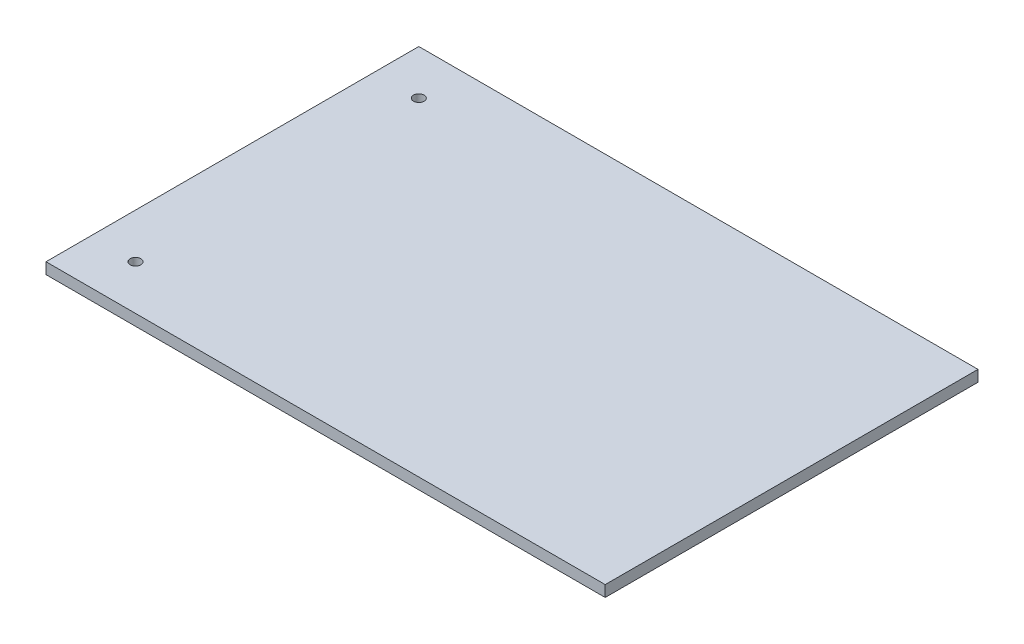
ISO-10303-21;
HEADER;
FILE_DESCRIPTION(('STEP AP214'),'2;1');
FILE_NAME('part.step','',(''),(''),'','','');
FILE_SCHEMA(('AUTOMOTIVE_DESIGN { 1 0 10303 214 1 1 1 1 }'));
ENDSEC;
DATA;
#1=APPLICATION_CONTEXT('core data for automotive mechanical design processes');
#2=APPLICATION_PROTOCOL_DEFINITION('international standard','automotive_design',2000,#1);
#3=PRODUCT_CONTEXT('',#1,'mechanical');
#4=PRODUCT('Part','Part','',(#3));
#5=PRODUCT_RELATED_PRODUCT_CATEGORY('part','',(#4));
#6=PRODUCT_DEFINITION_FORMATION('','',#4);
#7=PRODUCT_DEFINITION_CONTEXT('part definition',#1,'design');
#8=PRODUCT_DEFINITION('design','',#6,#7);
#9=PRODUCT_DEFINITION_SHAPE('','',#8);
#10=(LENGTH_UNIT() NAMED_UNIT(*) SI_UNIT(.MILLI.,.METRE.));
#11=(NAMED_UNIT(*) PLANE_ANGLE_UNIT() SI_UNIT($,.RADIAN.));
#12=(NAMED_UNIT(*) SI_UNIT($,.STERADIAN.) SOLID_ANGLE_UNIT());
#13=UNCERTAINTY_MEASURE_WITH_UNIT(LENGTH_MEASURE(1.E-05),#10,'distance_accuracy_value','');
#14=(GEOMETRIC_REPRESENTATION_CONTEXT(3) GLOBAL_UNCERTAINTY_ASSIGNED_CONTEXT((#13)) GLOBAL_UNIT_ASSIGNED_CONTEXT((#10,
#11,#12)) REPRESENTATION_CONTEXT('',''));
#15=CARTESIAN_POINT('',(0.,0.,0.));
#16=DIRECTION('',(0.,0.,1.));
#17=DIRECTION('',(1.,0.,0.));
#18=AXIS2_PLACEMENT_3D('',#15,#16,#17);
#19=CARTESIAN_POINT('',(-75.,3.,50.));
#20=DIRECTION('',(1.,0.,0.));
#21=DIRECTION('',(0.,0.,-1.));
#22=AXIS2_PLACEMENT_3D('',#19,#20,#21);
#23=PLANE('',#22);
#24=DIRECTION('',(0.,0.,1.));
#25=VECTOR('',#24,1.);
#26=CARTESIAN_POINT('',(-75.,0.,50.));
#27=LINE('',#26,#25);
#28=CARTESIAN_POINT('',(-75.,0.,-50.));
#29=VERTEX_POINT('',#28);
#30=CARTESIAN_POINT('',(-75.,0.,50.));
#31=VERTEX_POINT('',#30);
#32=EDGE_CURVE('E99',#29,#31,#27,.T.);
#33=ORIENTED_EDGE('',*,*,#32,.T.);
#34=DIRECTION('',(0.,-1.,0.));
#35=VECTOR('',#34,1.);
#36=CARTESIAN_POINT('',(-75.,3.,50.));
#37=LINE('',#36,#35);
#38=CARTESIAN_POINT('',(-75.,3.,50.));
#39=VERTEX_POINT('',#38);
#40=EDGE_CURVE('E11',#39,#31,#37,.T.);
#41=ORIENTED_EDGE('',*,*,#40,.F.);
#42=DIRECTION('',(0.,0.,1.));
#43=VECTOR('',#42,1.);
#44=CARTESIAN_POINT('',(-75.,3.,50.));
#45=LINE('',#44,#43);
#46=CARTESIAN_POINT('',(-75.,3.,-50.));
#47=VERTEX_POINT('',#46);
#48=EDGE_CURVE('E86',#47,#39,#45,.T.);
#49=ORIENTED_EDGE('',*,*,#48,.F.);
#50=DIRECTION('',(0.,-1.,0.));
#51=VECTOR('',#50,1.);
#52=CARTESIAN_POINT('',(-75.,3.,-50.));
#53=LINE('',#52,#51);
#54=EDGE_CURVE('E95',#47,#29,#53,.T.);
#55=ORIENTED_EDGE('',*,*,#54,.T.);
#56=EDGE_LOOP('',(#33,#41,#49,#55));
#57=FACE_BOUND('',#56,.T.);
#58=ADVANCED_FACE('F33',(#57),#23,.F.);
#59=CARTESIAN_POINT('',(75.,3.,50.));
#60=DIRECTION('',(0.,0.,-1.));
#61=DIRECTION('',(-1.,0.,0.));
#62=AXIS2_PLACEMENT_3D('',#59,#60,#61);
#63=PLANE('',#62);
#64=DIRECTION('',(1.,0.,0.));
#65=VECTOR('',#64,1.);
#66=CARTESIAN_POINT('',(75.,0.,50.));
#67=LINE('',#66,#65);
#68=CARTESIAN_POINT('',(75.,0.,50.));
#69=VERTEX_POINT('',#68);
#70=EDGE_CURVE('E90',#31,#69,#67,.T.);
#71=ORIENTED_EDGE('',*,*,#70,.T.);
#72=DIRECTION('',(0.,-1.,0.));
#73=VECTOR('',#72,1.);
#74=CARTESIAN_POINT('',(75.,3.,50.));
#75=LINE('',#74,#73);
#76=CARTESIAN_POINT('',(75.,3.,50.));
#77=VERTEX_POINT('',#76);
#78=EDGE_CURVE('E42',#77,#69,#75,.T.);
#79=ORIENTED_EDGE('',*,*,#78,.F.);
#80=DIRECTION('',(1.,0.,0.));
#81=VECTOR('',#80,1.);
#82=CARTESIAN_POINT('',(75.,3.,50.));
#83=LINE('',#82,#81);
#84=EDGE_CURVE('E81',#39,#77,#83,.T.);
#85=ORIENTED_EDGE('',*,*,#84,.F.);
#86=ORIENTED_EDGE('',*,*,#40,.T.);
#87=EDGE_LOOP('',(#71,#79,#85,#86));
#88=FACE_BOUND('',#87,.T.);
#89=ADVANCED_FACE('F89',(#88),#63,.F.);
#90=CARTESIAN_POINT('',(75.,3.,50.));
#91=DIRECTION('',(-1.,0.,0.));
#92=DIRECTION('',(0.,0.,1.));
#93=AXIS2_PLACEMENT_3D('',#90,#91,#92);
#94=PLANE('',#93);
#95=DIRECTION('',(0.,0.,-1.));
#96=VECTOR('',#95,1.);
#97=CARTESIAN_POINT('',(75.,0.,50.));
#98=LINE('',#97,#96);
#99=CARTESIAN_POINT('',(75.,0.,-50.));
#100=VERTEX_POINT('',#99);
#101=EDGE_CURVE('E68',#69,#100,#98,.T.);
#102=ORIENTED_EDGE('',*,*,#101,.T.);
#103=DIRECTION('',(0.,-1.,0.));
#104=VECTOR('',#103,1.);
#105=CARTESIAN_POINT('',(75.,3.,-50.));
#106=LINE('',#105,#104);
#107=CARTESIAN_POINT('',(75.,3.,-50.));
#108=VERTEX_POINT('',#107);
#109=EDGE_CURVE('E91',#108,#100,#106,.T.);
#110=ORIENTED_EDGE('',*,*,#109,.F.);
#111=DIRECTION('',(0.,0.,-1.));
#112=VECTOR('',#111,1.);
#113=CARTESIAN_POINT('',(75.,3.,50.));
#114=LINE('',#113,#112);
#115=EDGE_CURVE('E84',#77,#108,#114,.T.);
#116=ORIENTED_EDGE('',*,*,#115,.F.);
#117=ORIENTED_EDGE('',*,*,#78,.T.);
#118=EDGE_LOOP('',(#102,#110,#116,#117));
#119=FACE_BOUND('',#118,.T.);
#120=ADVANCED_FACE('F93',(#119),#94,.F.);
#121=CARTESIAN_POINT('',(75.,3.,-50.));
#122=DIRECTION('',(0.,0.,1.));
#123=DIRECTION('',(1.,0.,0.));
#124=AXIS2_PLACEMENT_3D('',#121,#122,#123);
#125=PLANE('',#124);
#126=DIRECTION('',(-1.,0.,0.));
#127=VECTOR('',#126,1.);
#128=CARTESIAN_POINT('',(75.,0.,-50.));
#129=LINE('',#128,#127);
#130=EDGE_CURVE('E74',#100,#29,#129,.T.);
#131=ORIENTED_EDGE('',*,*,#130,.T.);
#132=ORIENTED_EDGE('',*,*,#54,.F.);
#133=DIRECTION('',(-1.,0.,0.));
#134=VECTOR('',#133,1.);
#135=CARTESIAN_POINT('',(75.,3.,-50.));
#136=LINE('',#135,#134);
#137=EDGE_CURVE('E51',#108,#47,#136,.T.);
#138=ORIENTED_EDGE('',*,*,#137,.F.);
#139=ORIENTED_EDGE('',*,*,#109,.T.);
#140=EDGE_LOOP('',(#131,#132,#138,#139));
#141=FACE_BOUND('',#140,.T.);
#142=ADVANCED_FACE('F127',(#141),#125,.F.);
#143=CARTESIAN_POINT('',(0.,3.,0.));
#144=DIRECTION('',(0.,1.,0.));
#145=DIRECTION('',(0.,0.,1.));
#146=AXIS2_PLACEMENT_3D('',#143,#144,#145);
#147=PLANE('',#146);
#148=CARTESIAN_POINT('',(-63.,3.,38.));
#149=DIRECTION('',(0.,1.,0.));
#150=DIRECTION('',(0.,0.,1.));
#151=AXIS2_PLACEMENT_3D('',#148,#149,#150);
#152=CIRCLE('',#151,1.425);
#153=CARTESIAN_POINT('',(-63.,3.,39.425));
#154=VERTEX_POINT('',#153);
#155=EDGE_CURVE('E116',#154,#154,#152,.T.);
#156=ORIENTED_EDGE('',*,*,#155,.F.);
#157=EDGE_LOOP('',(#156));
#158=FACE_BOUND('',#157,.T.);
#159=CARTESIAN_POINT('',(-63.,3.,-38.));
#160=DIRECTION('',(0.,1.,0.));
#161=DIRECTION('',(0.,0.,1.));
#162=AXIS2_PLACEMENT_3D('',#159,#160,#161);
#163=CIRCLE('',#162,1.425);
#164=CARTESIAN_POINT('',(-63.,3.,-36.575));
#165=VERTEX_POINT('',#164);
#166=EDGE_CURVE('E108',#165,#165,#163,.T.);
#167=ORIENTED_EDGE('',*,*,#166,.F.);
#168=EDGE_LOOP('',(#167));
#169=FACE_BOUND('',#168,.T.);
#170=ORIENTED_EDGE('',*,*,#48,.T.);
#171=ORIENTED_EDGE('',*,*,#84,.T.);
#172=ORIENTED_EDGE('',*,*,#115,.T.);
#173=ORIENTED_EDGE('',*,*,#137,.T.);
#174=EDGE_LOOP('',(#170,#171,#172,#173));
#175=FACE_BOUND('',#174,.T.);
#176=ADVANCED_FACE('F82',(#158,#169,#175),#147,.T.);
#177=CARTESIAN_POINT('',(0.,0.,0.));
#178=DIRECTION('',(0.,1.,0.));
#179=DIRECTION('',(0.,0.,1.));
#180=AXIS2_PLACEMENT_3D('',#177,#178,#179);
#181=PLANE('',#180);
#182=CARTESIAN_POINT('',(-63.,0.,38.));
#183=DIRECTION('',(0.,1.,0.));
#184=DIRECTION('',(0.,0.,1.));
#185=AXIS2_PLACEMENT_3D('',#182,#183,#184);
#186=CIRCLE('',#185,1.425);
#187=CARTESIAN_POINT('',(-63.,0.,39.425));
#188=VERTEX_POINT('',#187);
#189=EDGE_CURVE('E36',#188,#188,#186,.T.);
#190=ORIENTED_EDGE('',*,*,#189,.T.);
#191=EDGE_LOOP('',(#190));
#192=FACE_BOUND('',#191,.T.);
#193=CARTESIAN_POINT('',(-63.,0.,-38.));
#194=DIRECTION('',(0.,1.,0.));
#195=DIRECTION('',(0.,0.,1.));
#196=AXIS2_PLACEMENT_3D('',#193,#194,#195);
#197=CIRCLE('',#196,1.425);
#198=CARTESIAN_POINT('',(-63.,0.,-36.575));
#199=VERTEX_POINT('',#198);
#200=EDGE_CURVE('E102',#199,#199,#197,.T.);
#201=ORIENTED_EDGE('',*,*,#200,.T.);
#202=EDGE_LOOP('',(#201));
#203=FACE_BOUND('',#202,.T.);
#204=ORIENTED_EDGE('',*,*,#32,.F.);
#205=ORIENTED_EDGE('',*,*,#130,.F.);
#206=ORIENTED_EDGE('',*,*,#101,.F.);
#207=ORIENTED_EDGE('',*,*,#70,.F.);
#208=EDGE_LOOP('',(#204,#205,#206,#207));
#209=FACE_BOUND('',#208,.T.);
#210=ADVANCED_FACE('F126',(#192,#203,#209),#181,.F.);
#211=CARTESIAN_POINT('',(-63.,-7.,-38.));
#212=DIRECTION('',(0.,1.,0.));
#213=DIRECTION('',(0.,0.,1.));
#214=AXIS2_PLACEMENT_3D('',#211,#212,#213);
#215=CYLINDRICAL_SURFACE('',#214,1.425);
#216=ORIENTED_EDGE('',*,*,#166,.T.);
#217=EDGE_LOOP('',(#216));
#218=FACE_BOUND('',#217,.T.);
#219=ORIENTED_EDGE('',*,*,#200,.F.);
#220=EDGE_LOOP('',(#219));
#221=FACE_BOUND('',#220,.T.);
#222=ADVANCED_FACE('F133',(#218,#221),#215,.F.);
#223=CARTESIAN_POINT('',(-63.,-7.,38.));
#224=DIRECTION('',(0.,1.,0.));
#225=DIRECTION('',(0.,0.,1.));
#226=AXIS2_PLACEMENT_3D('',#223,#224,#225);
#227=CYLINDRICAL_SURFACE('',#226,1.425);
#228=ORIENTED_EDGE('',*,*,#155,.T.);
#229=EDGE_LOOP('',(#228));
#230=FACE_BOUND('',#229,.T.);
#231=ORIENTED_EDGE('',*,*,#189,.F.);
#232=EDGE_LOOP('',(#231));
#233=FACE_BOUND('',#232,.T.);
#234=ADVANCED_FACE('F121',(#230,#233),#227,.F.);
#235=CLOSED_SHELL('',(#58,#89,#120,#142,#176,#210,#222,#234));
#236=MANIFOLD_SOLID_BREP('B2',#235);
#237=ADVANCED_BREP_SHAPE_REPRESENTATION('',(#18,#236),#14);
#238=SHAPE_DEFINITION_REPRESENTATION(#9,#237);
ENDSEC;
END-ISO-10303-21;
